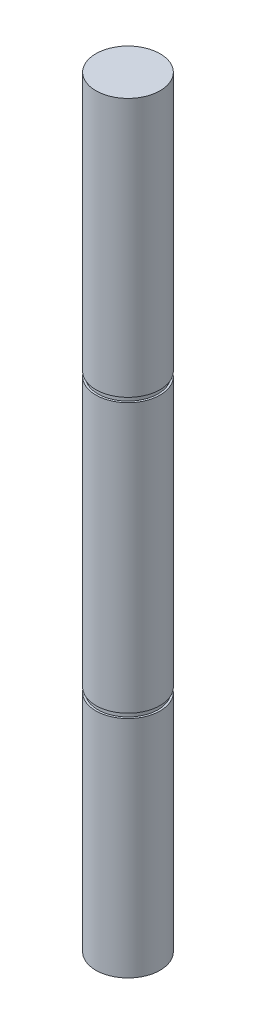
ISO-10303-21;
HEADER;
FILE_DESCRIPTION(('STEP AP214'),'2;1');
FILE_NAME('part.step','',(''),(''),'','','');
FILE_SCHEMA(('AUTOMOTIVE_DESIGN { 1 0 10303 214 1 1 1 1 }'));
ENDSEC;
DATA;
#1=APPLICATION_CONTEXT('core data for automotive mechanical design processes');
#2=APPLICATION_PROTOCOL_DEFINITION('international standard','automotive_design',2000,#1);
#3=PRODUCT_CONTEXT('',#1,'mechanical');
#4=PRODUCT('Part','Part','',(#3));
#5=PRODUCT_RELATED_PRODUCT_CATEGORY('part','',(#4));
#6=PRODUCT_DEFINITION_FORMATION('','',#4);
#7=PRODUCT_DEFINITION_CONTEXT('part definition',#1,'design');
#8=PRODUCT_DEFINITION('design','',#6,#7);
#9=PRODUCT_DEFINITION_SHAPE('','',#8);
#10=(LENGTH_UNIT() NAMED_UNIT(*) SI_UNIT(.MILLI.,.METRE.));
#11=(NAMED_UNIT(*) PLANE_ANGLE_UNIT() SI_UNIT($,.RADIAN.));
#12=(NAMED_UNIT(*) SI_UNIT($,.STERADIAN.) SOLID_ANGLE_UNIT());
#13=UNCERTAINTY_MEASURE_WITH_UNIT(LENGTH_MEASURE(1.E-05),#10,'distance_accuracy_value','');
#14=(GEOMETRIC_REPRESENTATION_CONTEXT(3) GLOBAL_UNCERTAINTY_ASSIGNED_CONTEXT((#13)) GLOBAL_UNIT_ASSIGNED_CONTEXT((#10,
#11,#12)) REPRESENTATION_CONTEXT('',''));
#15=CARTESIAN_POINT('',(0.,0.,0.));
#16=DIRECTION('',(0.,0.,1.));
#17=DIRECTION('',(1.,0.,0.));
#18=AXIS2_PLACEMENT_3D('',#15,#16,#17);
#19=CARTESIAN_POINT('',(0.,-113.03,0.));
#20=DIRECTION('',(0.,1.,0.));
#21=DIRECTION('',(0.,0.,1.));
#22=AXIS2_PLACEMENT_3D('',#19,#20,#21);
#23=CYLINDRICAL_SURFACE('',#22,4.7625);
#24=CARTESIAN_POINT('',(0.,-79.0067000000001,0.));
#25=DIRECTION('',(0.,1.,0.));
#26=DIRECTION('',(0.,0.,1.));
#27=AXIS2_PLACEMENT_3D('',#24,#25,#26);
#28=CIRCLE('',#27,4.7625);
#29=CARTESIAN_POINT('',(0.,-79.0067000000001,4.7625));
#30=VERTEX_POINT('',#29);
#31=EDGE_CURVE('E11',#30,#30,#28,.F.);
#32=CARTESIAN_POINT('',(0.,-39.1033,0.));
#33=DIRECTION('',(0.,-1.,0.));
#34=DIRECTION('',(0.,0.,-1.));
#35=AXIS2_PLACEMENT_3D('',#32,#33,#34);
#36=CIRCLE('',#35,4.7625);
#37=CARTESIAN_POINT('',(0.,-39.1033,4.7625));
#38=VERTEX_POINT('',#37);
#39=EDGE_CURVE('E61',#38,#38,#36,.F.);
#40=CARTESIAN_POINT('',(0.,-79.0067000000001,4.7625));
#41=CARTESIAN_POINT('',(0.,-78.5910395833334,4.7625));
#42=CARTESIAN_POINT('',(0.,-78.1753791666668,4.7625));
#43=CARTESIAN_POINT('',(0.,-77.3440583333334,4.7625));
#44=CARTESIAN_POINT('',(0.,-76.9283979166668,4.7625));
#45=CARTESIAN_POINT('',(0.,-76.0970770833334,4.7625));
#46=CARTESIAN_POINT('',(0.,-75.6814166666668,4.7625));
#47=CARTESIAN_POINT('',(0.,-74.8500958333334,4.7625));
#48=CARTESIAN_POINT('',(0.,-74.4344354166668,4.7625));
#49=CARTESIAN_POINT('',(0.,-73.6031145833334,4.7625));
#50=CARTESIAN_POINT('',(0.,-73.1874541666668,4.7625));
#51=CARTESIAN_POINT('',(0.,-72.3561333333334,4.7625));
#52=CARTESIAN_POINT('',(0.,-71.9404729166667,4.7625));
#53=CARTESIAN_POINT('',(0.,-71.1091520833334,4.7625));
#54=CARTESIAN_POINT('',(0.,-70.6934916666667,4.7625));
#55=CARTESIAN_POINT('',(0.,-69.8621708333334,4.7625));
#56=CARTESIAN_POINT('',(0.,-69.4465104166667,4.7625));
#57=CARTESIAN_POINT('',(0.,-68.6151895833334,4.7625));
#58=CARTESIAN_POINT('',(0.,-68.1995291666667,4.7625));
#59=CARTESIAN_POINT('',(0.,-67.3682083333334,4.7625));
#60=CARTESIAN_POINT('',(0.,-66.9525479166667,4.7625));
#61=CARTESIAN_POINT('',(0.,-66.1212270833334,4.7625));
#62=CARTESIAN_POINT('',(0.,-65.7055666666667,4.7625));
#63=CARTESIAN_POINT('',(0.,-64.8742458333334,4.7625));
#64=CARTESIAN_POINT('',(0.,-64.4585854166667,4.7625));
#65=CARTESIAN_POINT('',(0.,-63.6272645833334,4.7625));
#66=CARTESIAN_POINT('',(0.,-63.2116041666667,4.7625));
#67=CARTESIAN_POINT('',(0.,-62.3802833333334,4.7625));
#68=CARTESIAN_POINT('',(0.,-61.9646229166667,4.7625));
#69=CARTESIAN_POINT('',(0.,-61.1333020833334,4.7625));
#70=CARTESIAN_POINT('',(0.,-60.7176416666667,4.7625));
#71=CARTESIAN_POINT('',(0.,-59.8863208333334,4.7625));
#72=CARTESIAN_POINT('',(0.,-59.4706604166667,4.7625));
#73=CARTESIAN_POINT('',(0.,-58.6393395833334,4.7625));
#74=CARTESIAN_POINT('',(0.,-58.2236791666667,4.7625));
#75=CARTESIAN_POINT('',(0.,-57.3923583333334,4.7625));
#76=CARTESIAN_POINT('',(0.,-56.9766979166667,4.7625));
#77=CARTESIAN_POINT('',(0.,-56.1453770833334,4.7625));
#78=CARTESIAN_POINT('',(0.,-55.7297166666667,4.7625));
#79=CARTESIAN_POINT('',(0.,-54.8983958333334,4.7625));
#80=CARTESIAN_POINT('',(0.,-54.4827354166667,4.7625));
#81=CARTESIAN_POINT('',(0.,-53.6514145833334,4.7625));
#82=CARTESIAN_POINT('',(0.,-53.2357541666667,4.7625));
#83=CARTESIAN_POINT('',(0.,-52.4044333333334,4.7625));
#84=CARTESIAN_POINT('',(0.,-51.9887729166667,4.7625));
#85=CARTESIAN_POINT('',(0.,-51.1574520833334,4.7625));
#86=CARTESIAN_POINT('',(0.,-50.7417916666667,4.7625));
#87=CARTESIAN_POINT('',(0.,-49.9104708333334,4.7625));
#88=CARTESIAN_POINT('',(0.,-49.4948104166667,4.7625));
#89=CARTESIAN_POINT('',(0.,-48.6634895833334,4.7625));
#90=CARTESIAN_POINT('',(0.,-48.2478291666667,4.7625));
#91=CARTESIAN_POINT('',(0.,-47.4165083333334,4.7625));
#92=CARTESIAN_POINT('',(0.,-47.0008479166667,4.7625));
#93=CARTESIAN_POINT('',(0.,-46.1695270833334,4.7625));
#94=CARTESIAN_POINT('',(0.,-45.7538666666667,4.7625));
#95=CARTESIAN_POINT('',(0.,-44.9225458333334,4.7625));
#96=CARTESIAN_POINT('',(0.,-44.5068854166667,4.7625));
#97=CARTESIAN_POINT('',(0.,-43.6755645833334,4.7625));
#98=CARTESIAN_POINT('',(0.,-43.2599041666667,4.7625));
#99=CARTESIAN_POINT('',(0.,-42.4285833333334,4.7625));
#100=CARTESIAN_POINT('',(0.,-42.0129229166667,4.7625));
#101=CARTESIAN_POINT('',(0.,-41.1816020833334,4.7625));
#102=CARTESIAN_POINT('',(0.,-40.7659416666667,4.7625));
#103=CARTESIAN_POINT('',(0.,-39.9346208333334,4.7625));
#104=CARTESIAN_POINT('',(0.,-39.5189604166667,4.7625));
#105=CARTESIAN_POINT('',(0.,-39.1033,4.7625));
#106=B_SPLINE_CURVE_WITH_KNOTS('',3,(#40,#41,#42,#43,#44,#45,#46,#47,#48,#49,#50,#51,#52,#53,
#54,#55,#56,#57,#58,#59,#60,#61,#62,#63,#64,#65,#66,#67,#68,#69,#70,#71,#72,#73,#74,#75,#76,#77,
#78,#79,#80,#81,#82,#83,#84,#85,#86,#87,#88,#89,#90,#91,#92,#93,#94,#95,#96,#97,#98,#99,#100,
#101,#102,#103,#104,#105),.UNSPECIFIED.,.F.,.F.,(4,2,2,2,2,2,2,2,2,2,2,2,2,2,2,2,2,2,2,2,2,2,2,
2,2,2,2,2,2,2,2,2,4),(0.,1.24698125,2.4939625,3.74094375,4.987925,6.23490625000002,
7.48188750000002,8.72886875000002,9.97585000000002,11.22283125,12.4698125,13.71679375,14.963775,
16.21075625,17.4577375,18.70471875,19.9517,21.19868125,22.4456625,23.69264375,24.939625,
26.18660625,27.4335875000001,28.6805687500001,29.9275500000001,31.1745312500001,
32.4215125000001,33.6684937500001,34.9154750000001,36.1624562500001,37.4094375000001,
38.6564187500001,39.9034000000001),.UNSPECIFIED.);
#107=EDGE_CURVE('BSEAM42',#30,#38,#106,.T.);
#108=ORIENTED_EDGE('',*,*,#31,.F.);
#109=ORIENTED_EDGE('',*,*,#39,.F.);
#110=ORIENTED_EDGE('',*,*,#107,.T.);
#111=ORIENTED_EDGE('',*,*,#107,.F.);
#112=EDGE_LOOP('',(#108,#110,#109,#111));
#113=FACE_BOUND('',#112,.T.);
#114=ADVANCED_FACE('F42',(#113),#23,.T.);
#115=CARTESIAN_POINT('',(0.,-39.1033,0.));
#116=DIRECTION('',(0.,-1.,0.));
#117=DIRECTION('',(0.,0.,-1.));
#118=AXIS2_PLACEMENT_3D('',#115,#116,#117);
#119=PLANE('',#118);
#120=CARTESIAN_POINT('',(0.,-39.1033,0.));
#121=DIRECTION('',(0.,-1.,0.));
#122=DIRECTION('',(0.,0.,-1.));
#123=AXIS2_PLACEMENT_3D('',#120,#121,#122);
#124=CIRCLE('',#123,4.4704);
#125=CARTESIAN_POINT('',(0.,-39.1033,-4.4704));
#126=VERTEX_POINT('',#125);
#127=EDGE_CURVE('E66',#126,#126,#124,.T.);
#128=ORIENTED_EDGE('',*,*,#127,.T.);
#129=EDGE_LOOP('',(#128));
#130=FACE_BOUND('',#129,.T.);
#131=ORIENTED_EDGE('',*,*,#39,.T.);
#132=EDGE_LOOP('',(#131));
#133=FACE_BOUND('',#132,.T.);
#134=ADVANCED_FACE('F98',(#130,#133),#119,.F.);
#135=CARTESIAN_POINT('',(0.,-51.7475006184654,0.));
#136=DIRECTION('',(0.,1.,0.));
#137=DIRECTION('',(0.,0.,1.));
#138=AXIS2_PLACEMENT_3D('',#135,#136,#137);
#139=CYLINDRICAL_SURFACE('',#138,4.4704);
#140=CARTESIAN_POINT('',(0.,-38.4175,0.));
#141=DIRECTION('',(0.,-1.,0.));
#142=DIRECTION('',(0.,0.,-1.));
#143=AXIS2_PLACEMENT_3D('',#140,#141,#142);
#144=CIRCLE('',#143,4.4704);
#145=CARTESIAN_POINT('',(0.,-38.4175,-4.4704));
#146=VERTEX_POINT('',#145);
#147=EDGE_CURVE('E65',#146,#146,#144,.T.);
#148=ORIENTED_EDGE('',*,*,#147,.T.);
#149=EDGE_LOOP('',(#148));
#150=FACE_BOUND('',#149,.T.);
#151=ORIENTED_EDGE('',*,*,#127,.F.);
#152=EDGE_LOOP('',(#151));
#153=FACE_BOUND('',#152,.T.);
#154=ADVANCED_FACE('F103',(#150,#153),#139,.T.);
#155=CARTESIAN_POINT('',(0.,-113.03,0.));
#156=DIRECTION('',(0.,1.,0.));
#157=DIRECTION('',(0.,0.,1.));
#158=AXIS2_PLACEMENT_3D('',#155,#156,#157);
#159=CYLINDRICAL_SURFACE('',#158,4.7625);
#160=CARTESIAN_POINT('',(0.,0.,0.));
#161=DIRECTION('',(0.,1.,0.));
#162=DIRECTION('',(0.,0.,1.));
#163=AXIS2_PLACEMENT_3D('',#160,#161,#162);
#164=CIRCLE('',#163,4.7625);
#165=CARTESIAN_POINT('',(0.,0.,4.7625));
#166=VERTEX_POINT('',#165);
#167=EDGE_CURVE('E50',#166,#166,#164,.T.);
#168=CARTESIAN_POINT('',(0.,-38.4175,0.));
#169=DIRECTION('',(0.,-1.,0.));
#170=DIRECTION('',(0.,0.,-1.));
#171=AXIS2_PLACEMENT_3D('',#168,#169,#170);
#172=CIRCLE('',#171,4.7625);
#173=CARTESIAN_POINT('',(0.,-38.4175,4.7625));
#174=VERTEX_POINT('',#173);
#175=EDGE_CURVE('E45',#174,#174,#172,.F.);
#176=CARTESIAN_POINT('',(0.,0.,4.7625));
#177=CARTESIAN_POINT('',(0.,-0.400182291666667,4.7625));
#178=CARTESIAN_POINT('',(0.,-0.800364583333333,4.7625));
#179=CARTESIAN_POINT('',(0.,-1.60072916666667,4.7625));
#180=CARTESIAN_POINT('',(0.,-2.00091145833333,4.7625));
#181=CARTESIAN_POINT('',(0.,-2.80127604166667,4.7625));
#182=CARTESIAN_POINT('',(0.,-3.20145833333333,4.7625));
#183=CARTESIAN_POINT('',(0.,-4.00182291666667,4.7625));
#184=CARTESIAN_POINT('',(0.,-4.40200520833333,4.7625));
#185=CARTESIAN_POINT('',(0.,-5.20236979166667,4.7625));
#186=CARTESIAN_POINT('',(0.,-5.60255208333333,4.7625));
#187=CARTESIAN_POINT('',(0.,-6.40291666666667,4.7625));
#188=CARTESIAN_POINT('',(0.,-6.80309895833333,4.7625));
#189=CARTESIAN_POINT('',(0.,-7.60346354166667,4.7625));
#190=CARTESIAN_POINT('',(0.,-8.00364583333334,4.7625));
#191=CARTESIAN_POINT('',(0.,-8.80401041666667,4.7625));
#192=CARTESIAN_POINT('',(0.,-9.20419270833334,4.7625));
#193=CARTESIAN_POINT('',(0.,-10.0045572916667,4.7625));
#194=CARTESIAN_POINT('',(0.,-10.4047395833333,4.7625));
#195=CARTESIAN_POINT('',(0.,-11.2051041666667,4.7625));
#196=CARTESIAN_POINT('',(0.,-11.6052864583333,4.7625));
#197=CARTESIAN_POINT('',(0.,-12.4056510416667,4.7625));
#198=CARTESIAN_POINT('',(0.,-12.8058333333333,4.7625));
#199=CARTESIAN_POINT('',(0.,-13.6061979166667,4.7625));
#200=CARTESIAN_POINT('',(0.,-14.0063802083333,4.7625));
#201=CARTESIAN_POINT('',(0.,-14.8067447916667,4.7625));
#202=CARTESIAN_POINT('',(0.,-15.2069270833333,4.7625));
#203=CARTESIAN_POINT('',(0.,-16.0072916666667,4.7625));
#204=CARTESIAN_POINT('',(0.,-16.4074739583333,4.7625));
#205=CARTESIAN_POINT('',(0.,-17.2078385416667,4.7625));
#206=CARTESIAN_POINT('',(0.,-17.6080208333333,4.7625));
#207=CARTESIAN_POINT('',(0.,-18.4083854166667,4.7625));
#208=CARTESIAN_POINT('',(0.,-18.8085677083333,4.7625));
#209=CARTESIAN_POINT('',(0.,-19.6089322916667,4.7625));
#210=CARTESIAN_POINT('',(0.,-20.0091145833333,4.7625));
#211=CARTESIAN_POINT('',(0.,-20.8094791666667,4.7625));
#212=CARTESIAN_POINT('',(0.,-21.2096614583333,4.7625));
#213=CARTESIAN_POINT('',(0.,-22.0100260416667,4.7625));
#214=CARTESIAN_POINT('',(0.,-22.4102083333333,4.7625));
#215=CARTESIAN_POINT('',(0.,-23.2105729166667,4.7625));
#216=CARTESIAN_POINT('',(0.,-23.6107552083333,4.7625));
#217=CARTESIAN_POINT('',(0.,-24.4111197916667,4.7625));
#218=CARTESIAN_POINT('',(0.,-24.8113020833333,4.7625));
#219=CARTESIAN_POINT('',(0.,-25.6116666666667,4.7625));
#220=CARTESIAN_POINT('',(0.,-26.0118489583333,4.7625));
#221=CARTESIAN_POINT('',(0.,-26.8122135416667,4.7625));
#222=CARTESIAN_POINT('',(0.,-27.2123958333333,4.7625));
#223=CARTESIAN_POINT('',(0.,-28.0127604166667,4.7625));
#224=CARTESIAN_POINT('',(0.,-28.4129427083334,4.7625));
#225=CARTESIAN_POINT('',(0.,-29.2133072916667,4.7625));
#226=CARTESIAN_POINT('',(0.,-29.6134895833333,4.7625));
#227=CARTESIAN_POINT('',(0.,-30.4138541666667,4.7625));
#228=CARTESIAN_POINT('',(0.,-30.8140364583334,4.7625));
#229=CARTESIAN_POINT('',(0.,-31.6144010416667,4.7625));
#230=CARTESIAN_POINT('',(0.,-32.0145833333333,4.7625));
#231=CARTESIAN_POINT('',(0.,-32.8149479166667,4.7625));
#232=CARTESIAN_POINT('',(0.,-33.2151302083334,4.7625));
#233=CARTESIAN_POINT('',(0.,-34.0154947916667,4.7625));
#234=CARTESIAN_POINT('',(0.,-34.4156770833333,4.7625));
#235=CARTESIAN_POINT('',(0.,-35.2160416666667,4.7625));
#236=CARTESIAN_POINT('',(0.,-35.6162239583334,4.7625));
#237=CARTESIAN_POINT('',(0.,-36.4165885416667,4.7625));
#238=CARTESIAN_POINT('',(0.,-36.8167708333334,4.7625));
#239=CARTESIAN_POINT('',(0.,-37.6171354166667,4.7625));
#240=CARTESIAN_POINT('',(0.,-38.0173177083334,4.7625));
#241=CARTESIAN_POINT('',(0.,-38.4175,4.7625));
#242=B_SPLINE_CURVE_WITH_KNOTS('',3,(#176,#177,#178,#179,#180,#181,#182,#183,#184,#185,#186,
#187,#188,#189,#190,#191,#192,#193,#194,#195,#196,#197,#198,#199,#200,#201,#202,#203,#204,#205,
#206,#207,#208,#209,#210,#211,#212,#213,#214,#215,#216,#217,#218,#219,#220,#221,#222,#223,#224,
#225,#226,#227,#228,#229,#230,#231,#232,#233,#234,#235,#236,#237,#238,#239,#240,#241),
.UNSPECIFIED.,.F.,.F.,(4,2,2,2,2,2,2,2,2,2,2,2,2,2,2,2,2,2,2,2,2,2,2,2,2,2,2,2,2,2,2,2,4),(0.,
1.200546875,2.40109375,3.601640625,4.8021875,6.002734375,7.20328125,8.40382812500001,9.604375,
10.804921875,12.00546875,13.206015625,14.4065625,15.607109375,16.80765625,18.008203125,19.20875,
20.409296875,21.60984375,22.810390625,24.0109375,25.211484375,26.41203125,27.612578125,
28.813125,30.013671875,31.21421875,32.414765625,33.6153125,34.815859375,36.01640625,
37.216953125,38.4175),.UNSPECIFIED.);
#243=EDGE_CURVE('BSEAM80',#166,#174,#242,.T.);
#244=ORIENTED_EDGE('',*,*,#167,.F.);
#245=ORIENTED_EDGE('',*,*,#175,.T.);
#246=ORIENTED_EDGE('',*,*,#243,.T.);
#247=ORIENTED_EDGE('',*,*,#243,.F.);
#248=EDGE_LOOP('',(#244,#246,#245,#247));
#249=FACE_BOUND('',#248,.T.);
#250=ADVANCED_FACE('F80',(#249),#159,.T.);
#251=CARTESIAN_POINT('',(0.,0.,0.));
#252=DIRECTION('',(0.,1.,0.));
#253=DIRECTION('',(0.,0.,1.));
#254=AXIS2_PLACEMENT_3D('',#251,#252,#253);
#255=PLANE('',#254);
#256=ORIENTED_EDGE('',*,*,#167,.T.);
#257=EDGE_LOOP('',(#256));
#258=FACE_BOUND('',#257,.T.);
#259=ADVANCED_FACE('F85',(#258),#255,.T.);
#260=CARTESIAN_POINT('',(0.,-38.4175,0.));
#261=DIRECTION('',(0.,-1.,0.));
#262=DIRECTION('',(0.,0.,-1.));
#263=AXIS2_PLACEMENT_3D('',#260,#261,#262);
#264=PLANE('',#263);
#265=ORIENTED_EDGE('',*,*,#147,.F.);
#266=EDGE_LOOP('',(#265));
#267=FACE_BOUND('',#266,.T.);
#268=ORIENTED_EDGE('',*,*,#175,.F.);
#269=EDGE_LOOP('',(#268));
#270=FACE_BOUND('',#269,.T.);
#271=ADVANCED_FACE('F82',(#267,#270),#264,.T.);
#272=CARTESIAN_POINT('',(0.,-79.0067000000001,0.));
#273=DIRECTION('',(0.,1.,0.));
#274=DIRECTION('',(0.,0.,1.));
#275=AXIS2_PLACEMENT_3D('',#272,#273,#274);
#276=PLANE('',#275);
#277=CARTESIAN_POINT('',(0.,-79.0067000000001,0.));
#278=DIRECTION('',(0.,1.,0.));
#279=DIRECTION('',(0.,0.,1.));
#280=AXIS2_PLACEMENT_3D('',#277,#278,#279);
#281=CIRCLE('',#280,4.4704);
#282=CARTESIAN_POINT('',(0.,-79.0067000000001,-4.4704));
#283=VERTEX_POINT('',#282);
#284=EDGE_CURVE('E59',#283,#283,#281,.T.);
#285=ORIENTED_EDGE('',*,*,#284,.T.);
#286=EDGE_LOOP('',(#285));
#287=FACE_BOUND('',#286,.T.);
#288=ORIENTED_EDGE('',*,*,#31,.T.);
#289=EDGE_LOOP('',(#288));
#290=FACE_BOUND('',#289,.T.);
#291=ADVANCED_FACE('F84',(#287,#290),#276,.F.);
#292=CARTESIAN_POINT('',(0.,-66.3624993815347,0.));
#293=DIRECTION('',(0.,-1.,0.));
#294=DIRECTION('',(0.,0.,-1.));
#295=AXIS2_PLACEMENT_3D('',#292,#293,#294);
#296=CYLINDRICAL_SURFACE('',#295,4.4704);
#297=CARTESIAN_POINT('',(0.,-79.6925000000001,0.));
#298=DIRECTION('',(0.,1.,0.));
#299=DIRECTION('',(0.,0.,1.));
#300=AXIS2_PLACEMENT_3D('',#297,#298,#299);
#301=CIRCLE('',#300,4.4704);
#302=CARTESIAN_POINT('',(0.,-79.6925000000001,-4.4704));
#303=VERTEX_POINT('',#302);
#304=EDGE_CURVE('E216',#303,#303,#301,.T.);
#305=CARTESIAN_POINT('',(0.,-79.6925000000001,-4.4704));
#306=CARTESIAN_POINT('',(0.,-79.6853562500001,-4.4704));
#307=CARTESIAN_POINT('',(0.,-79.6782125000001,-4.4704));
#308=CARTESIAN_POINT('',(0.,-79.6639250000001,-4.4704));
#309=CARTESIAN_POINT('',(0.,-79.6567812500001,-4.4704));
#310=CARTESIAN_POINT('',(0.,-79.6424937500001,-4.4704));
#311=CARTESIAN_POINT('',(0.,-79.6353500000001,-4.4704));
#312=CARTESIAN_POINT('',(0.,-79.6210625000001,-4.4704));
#313=CARTESIAN_POINT('',(0.,-79.6139187500001,-4.4704));
#314=CARTESIAN_POINT('',(0.,-79.5996312500001,-4.4704));
#315=CARTESIAN_POINT('',(0.,-79.5924875000001,-4.4704));
#316=CARTESIAN_POINT('',(0.,-79.5782000000001,-4.4704));
#317=CARTESIAN_POINT('',(0.,-79.5710562500001,-4.4704));
#318=CARTESIAN_POINT('',(0.,-79.5567687500001,-4.4704));
#319=CARTESIAN_POINT('',(0.,-79.5496250000001,-4.4704));
#320=CARTESIAN_POINT('',(0.,-79.5353375000001,-4.4704));
#321=CARTESIAN_POINT('',(0.,-79.5281937500001,-4.4704));
#322=CARTESIAN_POINT('',(0.,-79.5139062500001,-4.4704));
#323=CARTESIAN_POINT('',(0.,-79.5067625000001,-4.4704));
#324=CARTESIAN_POINT('',(0.,-79.4924750000001,-4.4704));
#325=CARTESIAN_POINT('',(0.,-79.4853312500001,-4.4704));
#326=CARTESIAN_POINT('',(0.,-79.4710437500001,-4.4704));
#327=CARTESIAN_POINT('',(0.,-79.4639000000001,-4.4704));
#328=CARTESIAN_POINT('',(0.,-79.4496125000001,-4.4704));
#329=CARTESIAN_POINT('',(0.,-79.4424687500001,-4.4704));
#330=CARTESIAN_POINT('',(0.,-79.4281812500001,-4.4704));
#331=CARTESIAN_POINT('',(0.,-79.4210375000001,-4.4704));
#332=CARTESIAN_POINT('',(0.,-79.4067500000001,-4.4704));
#333=CARTESIAN_POINT('',(0.,-79.3996062500001,-4.4704));
#334=CARTESIAN_POINT('',(0.,-79.3853187500001,-4.4704));
#335=CARTESIAN_POINT('',(0.,-79.3781750000001,-4.4704));
#336=CARTESIAN_POINT('',(0.,-79.3638875000001,-4.4704));
#337=CARTESIAN_POINT('',(0.,-79.3567437500001,-4.4704));
#338=CARTESIAN_POINT('',(0.,-79.3424562500001,-4.4704));
#339=CARTESIAN_POINT('',(0.,-79.3353125000001,-4.4704));
#340=CARTESIAN_POINT('',(0.,-79.3210250000001,-4.4704));
#341=CARTESIAN_POINT('',(0.,-79.3138812500001,-4.4704));
#342=CARTESIAN_POINT('',(0.,-79.2995937500001,-4.4704));
#343=CARTESIAN_POINT('',(0.,-79.2924500000001,-4.4704));
#344=CARTESIAN_POINT('',(0.,-79.2781625000001,-4.4704));
#345=CARTESIAN_POINT('',(0.,-79.2710187500001,-4.4704));
#346=CARTESIAN_POINT('',(0.,-79.2567312500001,-4.4704));
#347=CARTESIAN_POINT('',(0.,-79.2495875000001,-4.4704));
#348=CARTESIAN_POINT('',(0.,-79.2353000000001,-4.4704));
#349=CARTESIAN_POINT('',(0.,-79.2281562500001,-4.4704));
#350=CARTESIAN_POINT('',(0.,-79.2138687500001,-4.4704));
#351=CARTESIAN_POINT('',(0.,-79.2067250000001,-4.4704));
#352=CARTESIAN_POINT('',(0.,-79.1924375000001,-4.4704));
#353=CARTESIAN_POINT('',(0.,-79.1852937500001,-4.4704));
#354=CARTESIAN_POINT('',(0.,-79.1710062500001,-4.4704));
#355=CARTESIAN_POINT('',(0.,-79.1638625000001,-4.4704));
#356=CARTESIAN_POINT('',(0.,-79.1495750000001,-4.4704));
#357=CARTESIAN_POINT('',(0.,-79.1424312500001,-4.4704));
#358=CARTESIAN_POINT('',(0.,-79.1281437500001,-4.4704));
#359=CARTESIAN_POINT('',(0.,-79.1210000000001,-4.4704));
#360=CARTESIAN_POINT('',(0.,-79.1067125000001,-4.4704));
#361=CARTESIAN_POINT('',(0.,-79.0995687500001,-4.4704));
#362=CARTESIAN_POINT('',(0.,-79.0852812500001,-4.4704));
#363=CARTESIAN_POINT('',(0.,-79.0781375000001,-4.4704));
#364=CARTESIAN_POINT('',(0.,-79.0638500000001,-4.4704));
#365=CARTESIAN_POINT('',(0.,-79.0567062500001,-4.4704));
#366=CARTESIAN_POINT('',(0.,-79.0424187500001,-4.4704));
#367=CARTESIAN_POINT('',(0.,-79.0352750000001,-4.4704));
#368=CARTESIAN_POINT('',(0.,-79.0209875000001,-4.4704));
#369=CARTESIAN_POINT('',(0.,-79.0138437500001,-4.4704));
#370=CARTESIAN_POINT('',(0.,-79.0067000000001,-4.4704));
#371=B_SPLINE_CURVE_WITH_KNOTS('',3,(#305,#306,#307,#308,#309,#310,#311,#312,#313,#314,#315,
#316,#317,#318,#319,#320,#321,#322,#323,#324,#325,#326,#327,#328,#329,#330,#331,#332,#333,#334,
#335,#336,#337,#338,#339,#340,#341,#342,#343,#344,#345,#346,#347,#348,#349,#350,#351,#352,#353,
#354,#355,#356,#357,#358,#359,#360,#361,#362,#363,#364,#365,#366,#367,#368,#369,#370),
.UNSPECIFIED.,.F.,.F.,(4,2,2,2,2,2,2,2,2,2,2,2,2,2,2,2,2,2,2,2,2,2,2,2,2,2,2,2,2,2,2,2,4),(0.,
0.0214312500000091,0.0428625000000044,0.0642937499999996,0.0857250000000087,0.107156250000004,
0.128587500000013,0.150018750000008,0.171450000000004,0.192881250000013,0.214312500000008,
0.235743750000003,0.257175000000012,0.278606250000007,0.300037500000003,0.321468750000012,
0.342900000000007,0.364331250000002,0.385762500000011,0.407193750000007,0.428625000000002,
0.450056250000011,0.471487500000006,0.492918750000002,0.514350000000011,0.535781250000006,
0.557212500000001,0.57864375000001,0.600075000000005,0.621506250000015,0.64293750000001,
0.664368750000005,0.685800000000014),.UNSPECIFIED.);
#372=EDGE_CURVE('BSEAM92',#303,#283,#371,.T.);
#373=ORIENTED_EDGE('',*,*,#304,.T.);
#374=ORIENTED_EDGE('',*,*,#284,.F.);
#375=ORIENTED_EDGE('',*,*,#372,.T.);
#376=ORIENTED_EDGE('',*,*,#372,.F.);
#377=EDGE_LOOP('',(#373,#375,#374,#376));
#378=FACE_BOUND('',#377,.T.);
#379=ADVANCED_FACE('F92',(#378),#296,.T.);
#380=CARTESIAN_POINT('',(0.,-113.03,0.));
#381=DIRECTION('',(0.,1.,0.));
#382=DIRECTION('',(0.,0.,1.));
#383=AXIS2_PLACEMENT_3D('',#380,#381,#382);
#384=PLANE('',#383);
#385=CARTESIAN_POINT('',(0.,-113.03,0.));
#386=DIRECTION('',(0.,1.,0.));
#387=DIRECTION('',(0.,0.,1.));
#388=AXIS2_PLACEMENT_3D('',#385,#386,#387);
#389=CIRCLE('',#388,4.7625);
#390=CARTESIAN_POINT('',(0.,-113.03,4.7625));
#391=VERTEX_POINT('',#390);
#392=EDGE_CURVE('E222',#391,#391,#389,.T.);
#393=ORIENTED_EDGE('',*,*,#392,.F.);
#394=EDGE_LOOP('',(#393));
#395=FACE_BOUND('',#394,.T.);
#396=ADVANCED_FACE('F145',(#395),#384,.F.);
#397=CARTESIAN_POINT('',(0.,-113.03,0.));
#398=DIRECTION('',(0.,1.,0.));
#399=DIRECTION('',(0.,0.,1.));
#400=AXIS2_PLACEMENT_3D('',#397,#398,#399);
#401=CYLINDRICAL_SURFACE('',#400,4.7625);
#402=CARTESIAN_POINT('',(0.,-79.6925000000001,0.));
#403=DIRECTION('',(0.,1.,0.));
#404=DIRECTION('',(0.,0.,1.));
#405=AXIS2_PLACEMENT_3D('',#402,#403,#404);
#406=CIRCLE('',#405,4.7625);
#407=CARTESIAN_POINT('',(0.,-79.6925000000001,4.7625));
#408=VERTEX_POINT('',#407);
#409=EDGE_CURVE('E219',#408,#408,#406,.F.);
#410=CARTESIAN_POINT('',(0.,-113.03,4.7625));
#411=CARTESIAN_POINT('',(0.,-112.682734375,4.7625));
#412=CARTESIAN_POINT('',(0.,-112.33546875,4.7625));
#413=CARTESIAN_POINT('',(0.,-111.6409375,4.7625));
#414=CARTESIAN_POINT('',(0.,-111.293671875,4.7625));
#415=CARTESIAN_POINT('',(0.,-110.599140625,4.7625));
#416=CARTESIAN_POINT('',(0.,-110.251875,4.7625));
#417=CARTESIAN_POINT('',(0.,-109.55734375,4.7625));
#418=CARTESIAN_POINT('',(0.,-109.210078125,4.7625));
#419=CARTESIAN_POINT('',(0.,-108.515546875,4.7625));
#420=CARTESIAN_POINT('',(0.,-108.16828125,4.7625));
#421=CARTESIAN_POINT('',(0.,-107.47375,4.7625));
#422=CARTESIAN_POINT('',(0.,-107.126484375,4.7625));
#423=CARTESIAN_POINT('',(0.,-106.431953125,4.7625));
#424=CARTESIAN_POINT('',(0.,-106.0846875,4.7625));
#425=CARTESIAN_POINT('',(0.,-105.39015625,4.7625));
#426=CARTESIAN_POINT('',(0.,-105.042890625,4.7625));
#427=CARTESIAN_POINT('',(0.,-104.348359375,4.7625));
#428=CARTESIAN_POINT('',(0.,-104.00109375,4.7625));
#429=CARTESIAN_POINT('',(0.,-103.3065625,4.7625));
#430=CARTESIAN_POINT('',(0.,-102.959296875,4.7625));
#431=CARTESIAN_POINT('',(0.,-102.264765625,4.7625));
#432=CARTESIAN_POINT('',(0.,-101.9175,4.7625));
#433=CARTESIAN_POINT('',(0.,-101.22296875,4.7625));
#434=CARTESIAN_POINT('',(0.,-100.875703125,4.7625));
#435=CARTESIAN_POINT('',(0.,-100.181171875,4.7625));
#436=CARTESIAN_POINT('',(0.,-99.83390625,4.7625));
#437=CARTESIAN_POINT('',(0.,-99.139375,4.7625));
#438=CARTESIAN_POINT('',(0.,-98.792109375,4.7625));
#439=CARTESIAN_POINT('',(0.,-98.097578125,4.7625));
#440=CARTESIAN_POINT('',(0.,-97.7503125,4.7625));
#441=CARTESIAN_POINT('',(0.,-97.0557812500001,4.7625));
#442=CARTESIAN_POINT('',(0.,-96.708515625,4.7625));
#443=CARTESIAN_POINT('',(0.,-96.013984375,4.7625));
#444=CARTESIAN_POINT('',(0.,-95.66671875,4.7625));
#445=CARTESIAN_POINT('',(0.,-94.9721875000001,4.7625));
#446=CARTESIAN_POINT('',(0.,-94.6249218750001,4.7625));
#447=CARTESIAN_POINT('',(0.,-93.9303906250001,4.7625));
#448=CARTESIAN_POINT('',(0.,-93.5831250000001,4.7625));
#449=CARTESIAN_POINT('',(0.,-92.8885937500001,4.7625));
#450=CARTESIAN_POINT('',(0.,-92.5413281250001,4.7625));
#451=CARTESIAN_POINT('',(0.,-91.8467968750001,4.7625));
#452=CARTESIAN_POINT('',(0.,-91.4995312500001,4.7625));
#453=CARTESIAN_POINT('',(0.,-90.8050000000001,4.7625));
#454=CARTESIAN_POINT('',(0.,-90.4577343750001,4.7625));
#455=CARTESIAN_POINT('',(0.,-89.7632031250001,4.7625));
#456=CARTESIAN_POINT('',(0.,-89.4159375000001,4.7625));
#457=CARTESIAN_POINT('',(0.,-88.7214062500001,4.7625));
#458=CARTESIAN_POINT('',(0.,-88.3741406250001,4.7625));
#459=CARTESIAN_POINT('',(0.,-87.6796093750001,4.7625));
#460=CARTESIAN_POINT('',(0.,-87.3323437500001,4.7625));
#461=CARTESIAN_POINT('',(0.,-86.6378125000001,4.7625));
#462=CARTESIAN_POINT('',(0.,-86.2905468750001,4.7625));
#463=CARTESIAN_POINT('',(0.,-85.5960156250001,4.7625));
#464=CARTESIAN_POINT('',(0.,-85.2487500000001,4.7625));
#465=CARTESIAN_POINT('',(0.,-84.5542187500001,4.7625));
#466=CARTESIAN_POINT('',(0.,-84.2069531250001,4.7625));
#467=CARTESIAN_POINT('',(0.,-83.5124218750001,4.7625));
#468=CARTESIAN_POINT('',(0.,-83.1651562500001,4.7625));
#469=CARTESIAN_POINT('',(0.,-82.4706250000001,4.7625));
#470=CARTESIAN_POINT('',(0.,-82.1233593750001,4.7625));
#471=CARTESIAN_POINT('',(0.,-81.4288281250001,4.7625));
#472=CARTESIAN_POINT('',(0.,-81.0815625000001,4.7625));
#473=CARTESIAN_POINT('',(0.,-80.3870312500001,4.7625));
#474=CARTESIAN_POINT('',(0.,-80.0397656250001,4.7625));
#475=CARTESIAN_POINT('',(0.,-79.6925000000001,4.7625));
#476=B_SPLINE_CURVE_WITH_KNOTS('',3,(#410,#411,#412,#413,#414,#415,#416,#417,#418,#419,#420,
#421,#422,#423,#424,#425,#426,#427,#428,#429,#430,#431,#432,#433,#434,#435,#436,#437,#438,#439,
#440,#441,#442,#443,#444,#445,#446,#447,#448,#449,#450,#451,#452,#453,#454,#455,#456,#457,#458,
#459,#460,#461,#462,#463,#464,#465,#466,#467,#468,#469,#470,#471,#472,#473,#474,#475),
.UNSPECIFIED.,.F.,.F.,(4,2,2,2,2,2,2,2,2,2,2,2,2,2,2,2,2,2,2,2,2,2,2,2,2,2,2,2,2,2,2,2,4),(0.,
1.04179687499999,2.08359374999999,3.12539062499999,4.16718749999999,5.20898437499998,
6.25078124999998,7.29257812499998,8.33437499999998,9.37617187499996,10.41796875,11.459765625,
12.5015625,13.543359375,14.58515625,15.626953125,16.66875,17.710546875,18.7523437499999,
19.7941406249999,20.8359374999999,21.8777343749999,22.9195312499999,23.9613281249999,
25.0031249999999,26.0449218749999,27.0867187499999,28.1285156249999,29.1703124999999,
30.2121093749999,31.2539062499999,32.2957031249999,33.3374999999999),.UNSPECIFIED.);
#477=EDGE_CURVE('BSEAM154',#391,#408,#476,.T.);
#478=ORIENTED_EDGE('',*,*,#392,.T.);
#479=ORIENTED_EDGE('',*,*,#409,.T.);
#480=ORIENTED_EDGE('',*,*,#477,.T.);
#481=ORIENTED_EDGE('',*,*,#477,.F.);
#482=EDGE_LOOP('',(#478,#480,#479,#481));
#483=FACE_BOUND('',#482,.T.);
#484=ADVANCED_FACE('F154',(#483),#401,.T.);
#485=CARTESIAN_POINT('',(0.,-79.6925000000001,0.));
#486=DIRECTION('',(0.,1.,0.));
#487=DIRECTION('',(0.,0.,1.));
#488=AXIS2_PLACEMENT_3D('',#485,#486,#487);
#489=PLANE('',#488);
#490=ORIENTED_EDGE('',*,*,#304,.F.);
#491=EDGE_LOOP('',(#490));
#492=FACE_BOUND('',#491,.T.);
#493=ORIENTED_EDGE('',*,*,#409,.F.);
#494=EDGE_LOOP('',(#493));
#495=FACE_BOUND('',#494,.T.);
#496=ADVANCED_FACE('F164',(#492,#495),#489,.T.);
#497=CLOSED_SHELL('',(#114,#134,#154,#250,#259,#271,#291,#379,#396,#484,#496));
#498=MANIFOLD_SOLID_BREP('B2',#497);
#499=ADVANCED_BREP_SHAPE_REPRESENTATION('',(#18,#498),#14);
#500=SHAPE_DEFINITION_REPRESENTATION(#9,#499);
ENDSEC;
END-ISO-10303-21;
